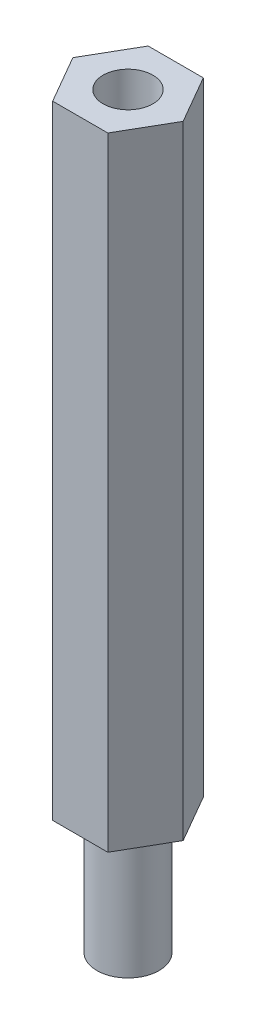
ISO-10303-21;
HEADER;
FILE_DESCRIPTION(('STEP AP214'),'2;1');
FILE_NAME('part.step','',(''),(''),'','','');
FILE_SCHEMA(('AUTOMOTIVE_DESIGN { 1 0 10303 214 1 1 1 1 }'));
ENDSEC;
DATA;
#1=APPLICATION_CONTEXT('core data for automotive mechanical design processes');
#2=APPLICATION_PROTOCOL_DEFINITION('international standard','automotive_design',2000,#1);
#3=PRODUCT_CONTEXT('',#1,'mechanical');
#4=PRODUCT('Part','Part','',(#3));
#5=PRODUCT_RELATED_PRODUCT_CATEGORY('part','',(#4));
#6=PRODUCT_DEFINITION_FORMATION('','',#4);
#7=PRODUCT_DEFINITION_CONTEXT('part definition',#1,'design');
#8=PRODUCT_DEFINITION('design','',#6,#7);
#9=PRODUCT_DEFINITION_SHAPE('','',#8);
#10=(LENGTH_UNIT() NAMED_UNIT(*) SI_UNIT(.MILLI.,.METRE.));
#11=(NAMED_UNIT(*) PLANE_ANGLE_UNIT() SI_UNIT($,.RADIAN.));
#12=(NAMED_UNIT(*) SI_UNIT($,.STERADIAN.) SOLID_ANGLE_UNIT());
#13=UNCERTAINTY_MEASURE_WITH_UNIT(LENGTH_MEASURE(1.E-05),#10,'distance_accuracy_value','');
#14=(GEOMETRIC_REPRESENTATION_CONTEXT(3) GLOBAL_UNCERTAINTY_ASSIGNED_CONTEXT((#13)) GLOBAL_UNIT_ASSIGNED_CONTEXT((#10,
#11,#12)) REPRESENTATION_CONTEXT('',''));
#15=CARTESIAN_POINT('',(0.,0.,0.));
#16=DIRECTION('',(0.,0.,1.));
#17=DIRECTION('',(1.,0.,0.));
#18=AXIS2_PLACEMENT_3D('',#15,#16,#17);
#19=CARTESIAN_POINT('',(0.,30.,0.));
#20=DIRECTION('',(0.,1.,0.));
#21=DIRECTION('',(0.,0.,1.));
#22=AXIS2_PLACEMENT_3D('',#19,#20,#21);
#23=PLANE('',#22);
#24=DIRECTION('',(0.499999999999995,0.,-0.866025403784442));
#25=VECTOR('',#24,1.);
#26=CARTESIAN_POINT('',(1.32790561913616,30.,2.29999999999998));
#27=LINE('',#26,#25);
#28=CARTESIAN_POINT('',(1.32790561913616,30.,2.29999999999998));
#29=VERTEX_POINT('',#28);
#30=CARTESIAN_POINT('',(2.65581123827227,30.,0.));
#31=VERTEX_POINT('',#30);
#32=EDGE_CURVE('E146',#29,#31,#27,.T.);
#33=ORIENTED_EDGE('',*,*,#32,.T.);
#34=DIRECTION('',(-0.500000000000001,0.,-0.866025403784438));
#35=VECTOR('',#34,1.);
#36=CARTESIAN_POINT('',(2.65581123827227,30.,0.));
#37=LINE('',#36,#35);
#38=CARTESIAN_POINT('',(1.32790561913613,30.,-2.3));
#39=VERTEX_POINT('',#38);
#40=EDGE_CURVE('E94',#31,#39,#37,.T.);
#41=ORIENTED_EDGE('',*,*,#40,.T.);
#42=DIRECTION('',(-1.,0.,0.));
#43=VECTOR('',#42,1.);
#44=CARTESIAN_POINT('',(1.32790561913613,30.,-2.3));
#45=LINE('',#44,#43);
#46=CARTESIAN_POINT('',(-1.32790561913615,30.,-2.29999999999999));
#47=VERTEX_POINT('',#46);
#48=EDGE_CURVE('E107',#39,#47,#45,.T.);
#49=ORIENTED_EDGE('',*,*,#48,.T.);
#50=DIRECTION('',(-0.499999999999995,0.,0.866025403784442));
#51=VECTOR('',#50,1.);
#52=CARTESIAN_POINT('',(-1.32790561913615,30.,-2.29999999999999));
#53=LINE('',#52,#51);
#54=CARTESIAN_POINT('',(-2.65581123827227,30.,0.));
#55=VERTEX_POINT('',#54);
#56=EDGE_CURVE('E101',#47,#55,#53,.T.);
#57=ORIENTED_EDGE('',*,*,#56,.T.);
#58=DIRECTION('',(0.500000000000007,0.,0.866025403784435));
#59=VECTOR('',#58,1.);
#60=CARTESIAN_POINT('',(-2.65581123827227,30.,0.));
#61=LINE('',#60,#59);
#62=CARTESIAN_POINT('',(-1.32790561913612,30.,2.30000000000001));
#63=VERTEX_POINT('',#62);
#64=EDGE_CURVE('E105',#55,#63,#61,.T.);
#65=ORIENTED_EDGE('',*,*,#64,.T.);
#66=DIRECTION('',(1.,0.,0.));
#67=VECTOR('',#66,1.);
#68=CARTESIAN_POINT('',(-1.32790561913612,30.,2.30000000000001));
#69=LINE('',#68,#67);
#70=EDGE_CURVE('E56',#63,#29,#69,.T.);
#71=ORIENTED_EDGE('',*,*,#70,.T.);
#72=EDGE_LOOP('',(#33,#41,#49,#57,#65,#71));
#73=FACE_BOUND('',#72,.T.);
#74=CARTESIAN_POINT('',(0.,30.,0.));
#75=DIRECTION('',(0.,1.,0.));
#76=DIRECTION('',(0.,0.,1.));
#77=AXIS2_PLACEMENT_3D('',#74,#75,#76);
#78=CIRCLE('',#77,1.2);
#79=CARTESIAN_POINT('',(0.,30.,1.2));
#80=VERTEX_POINT('',#79);
#81=EDGE_CURVE('E134',#80,#80,#78,.T.);
#82=ORIENTED_EDGE('',*,*,#81,.F.);
#83=EDGE_LOOP('',(#82));
#84=FACE_BOUND('',#83,.T.);
#85=ADVANCED_FACE('F38',(#73,#84),#23,.T.);
#86=CARTESIAN_POINT('',(0.,0.,0.));
#87=DIRECTION('',(0.,1.,0.));
#88=DIRECTION('',(0.,0.,1.));
#89=AXIS2_PLACEMENT_3D('',#86,#87,#88);
#90=PLANE('',#89);
#91=CARTESIAN_POINT('',(0.,0.,0.));
#92=DIRECTION('',(0.,1.,0.));
#93=DIRECTION('',(0.,0.,1.));
#94=AXIS2_PLACEMENT_3D('',#91,#92,#93);
#95=CIRCLE('',#94,1.5);
#96=CARTESIAN_POINT('',(0.,0.,1.5));
#97=VERTEX_POINT('',#96);
#98=EDGE_CURVE('E11',#97,#97,#95,.F.);
#99=ORIENTED_EDGE('',*,*,#98,.F.);
#100=EDGE_LOOP('',(#99));
#101=FACE_BOUND('',#100,.T.);
#102=DIRECTION('',(0.499999999999995,0.,-0.866025403784442));
#103=VECTOR('',#102,1.);
#104=CARTESIAN_POINT('',(1.32790561913616,0.,2.29999999999998));
#105=LINE('',#104,#103);
#106=CARTESIAN_POINT('',(1.32790561913616,0.,2.29999999999998));
#107=VERTEX_POINT('',#106);
#108=CARTESIAN_POINT('',(2.65581123827227,0.,0.));
#109=VERTEX_POINT('',#108);
#110=EDGE_CURVE('E129',#107,#109,#105,.T.);
#111=ORIENTED_EDGE('',*,*,#110,.F.);
#112=DIRECTION('',(1.,0.,0.));
#113=VECTOR('',#112,1.);
#114=CARTESIAN_POINT('',(-1.32790561913612,0.,2.30000000000001));
#115=LINE('',#114,#113);
#116=CARTESIAN_POINT('',(-1.32790561913612,0.,2.30000000000001));
#117=VERTEX_POINT('',#116);
#118=EDGE_CURVE('E85',#117,#107,#115,.T.);
#119=ORIENTED_EDGE('',*,*,#118,.F.);
#120=DIRECTION('',(0.500000000000007,0.,0.866025403784435));
#121=VECTOR('',#120,1.);
#122=CARTESIAN_POINT('',(-2.65581123827227,0.,0.));
#123=LINE('',#122,#121);
#124=CARTESIAN_POINT('',(-2.65581123827227,0.,0.));
#125=VERTEX_POINT('',#124);
#126=EDGE_CURVE('E79',#125,#117,#123,.T.);
#127=ORIENTED_EDGE('',*,*,#126,.F.);
#128=DIRECTION('',(-0.499999999999995,0.,0.866025403784442));
#129=VECTOR('',#128,1.);
#130=CARTESIAN_POINT('',(-1.32790561913615,0.,-2.29999999999999));
#131=LINE('',#130,#129);
#132=CARTESIAN_POINT('',(-1.32790561913615,0.,-2.29999999999999));
#133=VERTEX_POINT('',#132);
#134=EDGE_CURVE('E116',#133,#125,#131,.T.);
#135=ORIENTED_EDGE('',*,*,#134,.F.);
#136=DIRECTION('',(-1.,0.,0.));
#137=VECTOR('',#136,1.);
#138=CARTESIAN_POINT('',(1.32790561913613,0.,-2.3));
#139=LINE('',#138,#137);
#140=CARTESIAN_POINT('',(1.32790561913613,0.,-2.3));
#141=VERTEX_POINT('',#140);
#142=EDGE_CURVE('E137',#141,#133,#139,.T.);
#143=ORIENTED_EDGE('',*,*,#142,.F.);
#144=DIRECTION('',(-0.500000000000001,0.,-0.866025403784438));
#145=VECTOR('',#144,1.);
#146=CARTESIAN_POINT('',(2.65581123827227,0.,0.));
#147=LINE('',#146,#145);
#148=EDGE_CURVE('E133',#109,#141,#147,.T.);
#149=ORIENTED_EDGE('',*,*,#148,.F.);
#150=EDGE_LOOP('',(#111,#119,#127,#135,#143,#149));
#151=FACE_BOUND('',#150,.T.);
#152=ADVANCED_FACE('F163',(#101,#151),#90,.F.);
#153=CARTESIAN_POINT('',(1.32790561913616,30.,2.29999999999998));
#154=DIRECTION('',(-0.866025403784442,0.,-0.499999999999995));
#155=DIRECTION('',(-0.499999999999995,0.,0.866025403784442));
#156=AXIS2_PLACEMENT_3D('',#153,#154,#155);
#157=PLANE('',#156);
#158=ORIENTED_EDGE('',*,*,#110,.T.);
#159=DIRECTION('',(0.,-1.,0.));
#160=VECTOR('',#159,1.);
#161=CARTESIAN_POINT('',(2.65581123827227,30.,0.));
#162=LINE('',#161,#160);
#163=EDGE_CURVE('E48',#31,#109,#162,.T.);
#164=ORIENTED_EDGE('',*,*,#163,.F.);
#165=ORIENTED_EDGE('',*,*,#32,.F.);
#166=DIRECTION('',(0.,-1.,0.));
#167=VECTOR('',#166,1.);
#168=CARTESIAN_POINT('',(1.32790561913616,30.,2.29999999999998));
#169=LINE('',#168,#167);
#170=EDGE_CURVE('E125',#29,#107,#169,.T.);
#171=ORIENTED_EDGE('',*,*,#170,.T.);
#172=EDGE_LOOP('',(#158,#164,#165,#171));
#173=FACE_BOUND('',#172,.T.);
#174=ADVANCED_FACE('F40',(#173),#157,.F.);
#175=CARTESIAN_POINT('',(2.65581123827227,30.,0.));
#176=DIRECTION('',(-0.866025403784438,0.,0.500000000000001));
#177=DIRECTION('',(0.500000000000001,0.,0.866025403784438));
#178=AXIS2_PLACEMENT_3D('',#175,#176,#177);
#179=PLANE('',#178);
#180=ORIENTED_EDGE('',*,*,#148,.T.);
#181=DIRECTION('',(0.,-1.,0.));
#182=VECTOR('',#181,1.);
#183=CARTESIAN_POINT('',(1.32790561913613,30.,-2.3));
#184=LINE('',#183,#182);
#185=EDGE_CURVE('E153',#39,#141,#184,.T.);
#186=ORIENTED_EDGE('',*,*,#185,.F.);
#187=ORIENTED_EDGE('',*,*,#40,.F.);
#188=ORIENTED_EDGE('',*,*,#163,.T.);
#189=EDGE_LOOP('',(#180,#186,#187,#188));
#190=FACE_BOUND('',#189,.T.);
#191=ADVANCED_FACE('F158',(#190),#179,.F.);
#192=CARTESIAN_POINT('',(1.32790561913613,30.,-2.3));
#193=DIRECTION('',(0.,0.,1.));
#194=DIRECTION('',(1.,0.,0.));
#195=AXIS2_PLACEMENT_3D('',#192,#193,#194);
#196=PLANE('',#195);
#197=ORIENTED_EDGE('',*,*,#142,.T.);
#198=DIRECTION('',(0.,-1.,0.));
#199=VECTOR('',#198,1.);
#200=CARTESIAN_POINT('',(-1.32790561913615,30.,-2.29999999999999));
#201=LINE('',#200,#199);
#202=EDGE_CURVE('E118',#47,#133,#201,.T.);
#203=ORIENTED_EDGE('',*,*,#202,.F.);
#204=ORIENTED_EDGE('',*,*,#48,.F.);
#205=ORIENTED_EDGE('',*,*,#185,.T.);
#206=EDGE_LOOP('',(#197,#203,#204,#205));
#207=FACE_BOUND('',#206,.T.);
#208=ADVANCED_FACE('F166',(#207),#196,.F.);
#209=CARTESIAN_POINT('',(-1.32790561913615,30.,-2.29999999999999));
#210=DIRECTION('',(0.866025403784441,0.,0.499999999999995));
#211=DIRECTION('',(0.499999999999995,0.,-0.866025403784442));
#212=AXIS2_PLACEMENT_3D('',#209,#210,#211);
#213=PLANE('',#212);
#214=ORIENTED_EDGE('',*,*,#134,.T.);
#215=DIRECTION('',(0.,-1.,0.));
#216=VECTOR('',#215,1.);
#217=CARTESIAN_POINT('',(-2.65581123827227,30.,0.));
#218=LINE('',#217,#216);
#219=EDGE_CURVE('E113',#55,#125,#218,.T.);
#220=ORIENTED_EDGE('',*,*,#219,.F.);
#221=ORIENTED_EDGE('',*,*,#56,.F.);
#222=ORIENTED_EDGE('',*,*,#202,.T.);
#223=EDGE_LOOP('',(#214,#220,#221,#222));
#224=FACE_BOUND('',#223,.T.);
#225=ADVANCED_FACE('F114',(#224),#213,.F.);
#226=CARTESIAN_POINT('',(-2.65581123827227,30.,0.));
#227=DIRECTION('',(0.866025403784435,0.,-0.500000000000007));
#228=DIRECTION('',(-0.500000000000007,0.,-0.866025403784435));
#229=AXIS2_PLACEMENT_3D('',#226,#227,#228);
#230=PLANE('',#229);
#231=ORIENTED_EDGE('',*,*,#126,.T.);
#232=DIRECTION('',(0.,-1.,0.));
#233=VECTOR('',#232,1.);
#234=CARTESIAN_POINT('',(-1.32790561913612,30.,2.30000000000001));
#235=LINE('',#234,#233);
#236=EDGE_CURVE('E119',#63,#117,#235,.T.);
#237=ORIENTED_EDGE('',*,*,#236,.F.);
#238=ORIENTED_EDGE('',*,*,#64,.F.);
#239=ORIENTED_EDGE('',*,*,#219,.T.);
#240=EDGE_LOOP('',(#231,#237,#238,#239));
#241=FACE_BOUND('',#240,.T.);
#242=ADVANCED_FACE('F121',(#241),#230,.F.);
#243=CARTESIAN_POINT('',(-1.32790561913612,30.,2.30000000000001));
#244=DIRECTION('',(0.,0.,-1.));
#245=DIRECTION('',(-1.,0.,0.));
#246=AXIS2_PLACEMENT_3D('',#243,#244,#245);
#247=PLANE('',#246);
#248=ORIENTED_EDGE('',*,*,#118,.T.);
#249=ORIENTED_EDGE('',*,*,#170,.F.);
#250=ORIENTED_EDGE('',*,*,#70,.F.);
#251=ORIENTED_EDGE('',*,*,#236,.T.);
#252=EDGE_LOOP('',(#248,#249,#250,#251));
#253=FACE_BOUND('',#252,.T.);
#254=ADVANCED_FACE('F203',(#253),#247,.F.);
#255=CARTESIAN_POINT('',(0.,30.,0.));
#256=DIRECTION('',(0.,-1.,0.));
#257=DIRECTION('',(0.,0.,-1.));
#258=AXIS2_PLACEMENT_3D('',#255,#256,#257);
#259=CYLINDRICAL_SURFACE('',#258,1.2);
#260=ORIENTED_EDGE('',*,*,#81,.T.);
#261=EDGE_LOOP('',(#260));
#262=FACE_BOUND('',#261,.T.);
#263=CARTESIAN_POINT('',(0.,0.,0.));
#264=DIRECTION('',(0.,1.,0.));
#265=DIRECTION('',(0.,0.,1.));
#266=AXIS2_PLACEMENT_3D('',#263,#264,#265);
#267=CIRCLE('',#266,1.2);
#268=CARTESIAN_POINT('',(0.,0.,1.2));
#269=VERTEX_POINT('',#268);
#270=EDGE_CURVE('E173',#269,#269,#267,.T.);
#271=ORIENTED_EDGE('',*,*,#270,.F.);
#272=EDGE_LOOP('',(#271));
#273=FACE_BOUND('',#272,.T.);
#274=ADVANCED_FACE('F206',(#262,#273),#259,.F.);
#275=CARTESIAN_POINT('',(0.,0.,0.));
#276=DIRECTION('',(0.,-1.,0.));
#277=DIRECTION('',(0.,0.,-1.));
#278=AXIS2_PLACEMENT_3D('',#275,#276,#277);
#279=PLANE('',#278);
#280=ORIENTED_EDGE('',*,*,#270,.T.);
#281=EDGE_LOOP('',(#280));
#282=FACE_BOUND('',#281,.T.);
#283=ADVANCED_FACE('F190',(#282),#279,.F.);
#284=CARTESIAN_POINT('',(0.,-6.,0.));
#285=DIRECTION('',(0.,1.,0.));
#286=DIRECTION('',(0.,0.,1.));
#287=AXIS2_PLACEMENT_3D('',#284,#285,#286);
#288=CYLINDRICAL_SURFACE('',#287,1.5);
#289=CARTESIAN_POINT('',(0.,-6.,0.));
#290=DIRECTION('',(0.,-1.,0.));
#291=DIRECTION('',(0.,0.,-1.));
#292=AXIS2_PLACEMENT_3D('',#289,#290,#291);
#293=CIRCLE('',#292,1.5);
#294=CARTESIAN_POINT('',(0.,-6.,-1.5));
#295=VERTEX_POINT('',#294);
#296=EDGE_CURVE('E177',#295,#295,#293,.T.);
#297=ORIENTED_EDGE('',*,*,#296,.F.);
#298=EDGE_LOOP('',(#297));
#299=FACE_BOUND('',#298,.T.);
#300=ORIENTED_EDGE('',*,*,#98,.T.);
#301=EDGE_LOOP('',(#300));
#302=FACE_BOUND('',#301,.T.);
#303=ADVANCED_FACE('F187',(#299,#302),#288,.T.);
#304=CARTESIAN_POINT('',(0.,-6.,0.));
#305=DIRECTION('',(0.,-1.,0.));
#306=DIRECTION('',(0.,0.,-1.));
#307=AXIS2_PLACEMENT_3D('',#304,#305,#306);
#308=PLANE('',#307);
#309=ORIENTED_EDGE('',*,*,#296,.T.);
#310=EDGE_LOOP('',(#309));
#311=FACE_BOUND('',#310,.T.);
#312=ADVANCED_FACE('F185',(#311),#308,.T.);
#313=CLOSED_SHELL('',(#85,#152,#174,#191,#208,#225,#242,#254,#274,#283,#303,#312));
#314=MANIFOLD_SOLID_BREP('B2',#313);
#315=ADVANCED_BREP_SHAPE_REPRESENTATION('',(#18,#314),#14);
#316=SHAPE_DEFINITION_REPRESENTATION(#9,#315);
ENDSEC;
END-ISO-10303-21;
